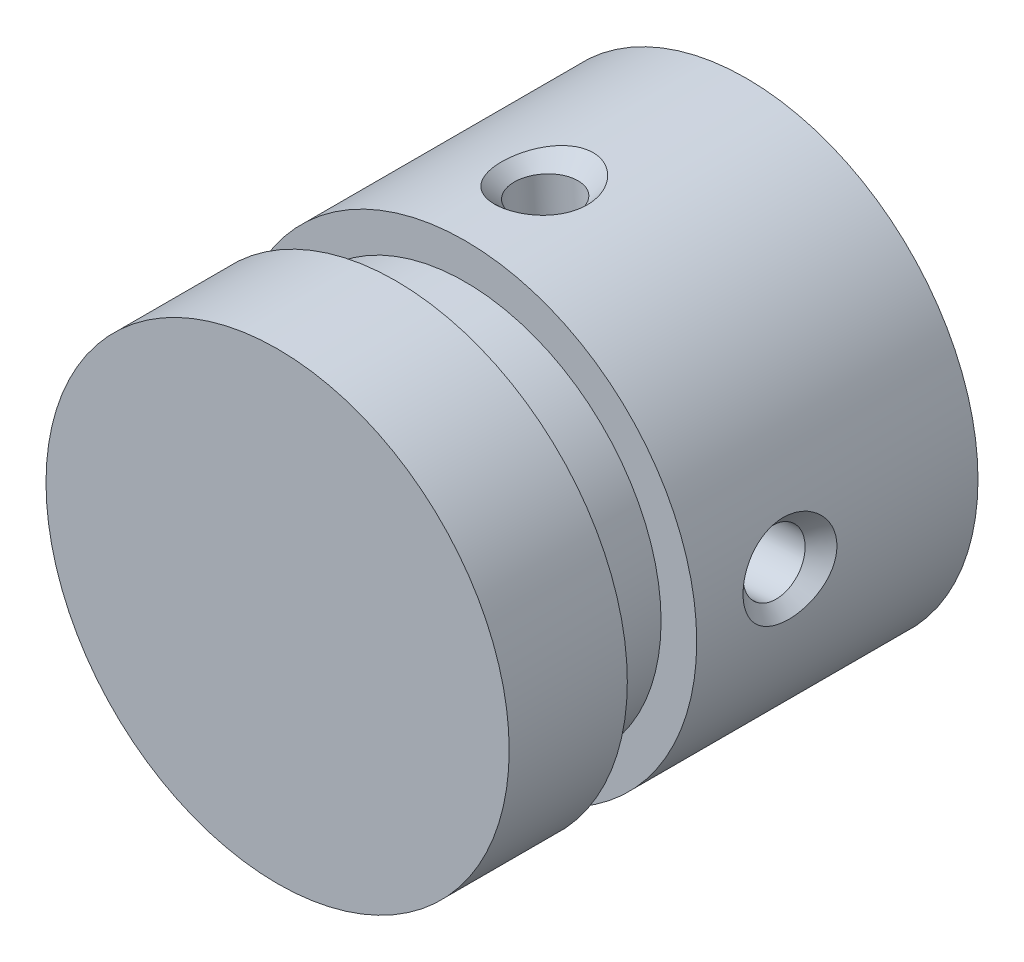
ISO-10303-21;
HEADER;
FILE_DESCRIPTION(('STEP AP214'),'2;1');
FILE_NAME('part.step','',(''),(''),'','','');
FILE_SCHEMA(('AUTOMOTIVE_DESIGN { 1 0 10303 214 1 1 1 1 }'));
ENDSEC;
DATA;
#1=APPLICATION_CONTEXT('core data for automotive mechanical design processes');
#2=APPLICATION_PROTOCOL_DEFINITION('international standard','automotive_design',2000,#1);
#3=PRODUCT_CONTEXT('',#1,'mechanical');
#4=PRODUCT('Part','Part','',(#3));
#5=PRODUCT_RELATED_PRODUCT_CATEGORY('part','',(#4));
#6=PRODUCT_DEFINITION_FORMATION('','',#4);
#7=PRODUCT_DEFINITION_CONTEXT('part definition',#1,'design');
#8=PRODUCT_DEFINITION('design','',#6,#7);
#9=PRODUCT_DEFINITION_SHAPE('','',#8);
#10=(LENGTH_UNIT() NAMED_UNIT(*) SI_UNIT(.MILLI.,.METRE.));
#11=(NAMED_UNIT(*) PLANE_ANGLE_UNIT() SI_UNIT($,.RADIAN.));
#12=(NAMED_UNIT(*) SI_UNIT($,.STERADIAN.) SOLID_ANGLE_UNIT());
#13=UNCERTAINTY_MEASURE_WITH_UNIT(LENGTH_MEASURE(1.E-05),#10,'distance_accuracy_value','');
#14=(GEOMETRIC_REPRESENTATION_CONTEXT(3) GLOBAL_UNCERTAINTY_ASSIGNED_CONTEXT((#13)) GLOBAL_UNIT_ASSIGNED_CONTEXT((#10,
#11,#12)) REPRESENTATION_CONTEXT('',''));
#15=CARTESIAN_POINT('',(0.,0.,0.));
#16=DIRECTION('',(0.,0.,1.));
#17=DIRECTION('',(1.,0.,0.));
#18=AXIS2_PLACEMENT_3D('',#15,#16,#17);
#19=CARTESIAN_POINT('',(0.,0.,25.));
#20=DIRECTION('',(0.,0.,-1.));
#21=DIRECTION('',(-1.,0.,0.));
#22=AXIS2_PLACEMENT_3D('',#19,#20,#21);
#23=CYLINDRICAL_SURFACE('',#22,12.35);
#24=CARTESIAN_POINT('',(0.,0.,0.));
#25=DIRECTION('',(0.,0.,1.));
#26=DIRECTION('',(1.,0.,0.));
#27=AXIS2_PLACEMENT_3D('',#24,#25,#26);
#28=CIRCLE('',#27,12.35);
#29=CARTESIAN_POINT('',(12.35,0.,0.));
#30=VERTEX_POINT('',#29);
#31=EDGE_CURVE('E128',#30,#30,#28,.T.);
#32=ORIENTED_EDGE('',*,*,#31,.T.);
#33=EDGE_LOOP('',(#32));
#34=FACE_BOUND('',#33,.T.);
#35=CARTESIAN_POINT('',(-2.14445012576023,12.1623944390861,7.99854520423865));
#36=CARTESIAN_POINT('',(-2.05248965444552,12.1786080947724,7.92261083689134));
#37=CARTESIAN_POINT('',(-1.95459043839527,12.1947909562161,7.85383672078203));
#38=CARTESIAN_POINT('',(-1.74876403507585,12.2260027582202,7.73295754496976));
#39=CARTESIAN_POINT('',(-1.64083616347095,12.2410316199058,7.68085362388761));
#40=CARTESIAN_POINT('',(-1.41212457402826,12.2695672463463,7.59340282051027));
#41=CARTESIAN_POINT('',(-1.29097326411596,12.2829672865543,7.55897325286086));
#42=CARTESIAN_POINT('',(-1.04413000846501,12.3064062867462,7.51253094688949));
#43=CARTESIAN_POINT('',(-0.918439319187852,12.3164461690125,7.50051205322989));
#44=CARTESIAN_POINT('',(-0.675698030104013,12.3320589155647,7.49955498806939));
#45=CARTESIAN_POINT('',(-0.558667982671112,12.3378984564503,7.50903776324741));
#46=CARTESIAN_POINT('',(-0.327738674063508,12.3461912217196,7.54742218348827));
#47=CARTESIAN_POINT('',(-0.213839111754561,12.3486447729407,7.57632195389715));
#48=CARTESIAN_POINT('',(0.00712151588528481,12.3504901915595,7.65203728876816));
#49=CARTESIAN_POINT('',(0.114216784791292,12.3498988442682,7.69875332035321));
#50=CARTESIAN_POINT('',(0.319764512159961,12.3462883158084,7.80828208782504));
#51=CARTESIAN_POINT('',(0.418214929060633,12.3432685628507,7.87109861233971));
#52=CARTESIAN_POINT('',(0.610594036534136,12.3352968399232,8.01527962322423));
#53=CARTESIAN_POINT('',(0.703811405001816,12.3302319048806,8.09758519969596));
#54=CARTESIAN_POINT('',(0.876514676151976,12.3191609779337,8.27545378345679));
#55=CARTESIAN_POINT('',(0.95599537166924,12.313154630806,8.37102179349911));
#56=CARTESIAN_POINT('',(1.10655578799026,12.3005799291626,8.58208826047784));
#57=CARTESIAN_POINT('',(1.17620182156481,12.2940104274476,8.69861018779477));
#58=CARTESIAN_POINT('',(1.29646041080678,12.2819115591784,8.94114049404131));
#59=CARTESIAN_POINT('',(1.34706663119011,12.2763825391382,9.06715201381749));
#60=CARTESIAN_POINT('',(1.43130478263113,12.2668581473865,9.33463620080081));
#61=CARTESIAN_POINT('',(1.46348579526123,12.2629986380813,9.47657230980064));
#62=CARTESIAN_POINT('',(1.50450180070155,12.2580341632864,9.7638299755613));
#63=CARTESIAN_POINT('',(1.51333243015598,12.2569297126212,9.9091521599417));
#64=CARTESIAN_POINT('',(1.50738869690031,12.2576627651379,10.2037779358134));
#65=CARTESIAN_POINT('',(1.49188333776727,12.2595913779993,10.3530672000059));
#66=CARTESIAN_POINT('',(1.43618352838113,12.2662404008367,10.6469266706734));
#67=CARTESIAN_POINT('',(1.39598632582569,12.2709611220359,10.7914963491826));
#68=CARTESIAN_POINT('',(1.29171367785535,12.2823740630543,11.071559873785));
#69=CARTESIAN_POINT('',(1.227658041762,12.2890646463618,11.2070611394563));
#70=CARTESIAN_POINT('',(1.07690064068408,12.3031904206987,11.4648376698635));
#71=CARTESIAN_POINT('',(0.990199918513972,12.3106255774304,11.5871135432669));
#72=CARTESIAN_POINT('',(0.799522048382524,12.3244491980962,11.8098969015238));
#73=CARTESIAN_POINT('',(0.696280858260916,12.3308657426719,11.9110304833458));
#74=CARTESIAN_POINT('',(0.472927965312659,12.3414456772621,12.0927332686475));
#75=CARTESIAN_POINT('',(0.352826745350583,12.3456104595815,12.1733151632792));
#76=CARTESIAN_POINT('',(0.109833128047279,12.3500583608054,12.3042503995803));
#77=CARTESIAN_POINT('',(-0.0119985029205748,12.3506352080917,12.3565588578163));
#78=CARTESIAN_POINT('',(-0.263148991651637,12.3478322333979,12.4378810569299));
#79=CARTESIAN_POINT('',(-0.392462123874528,12.3444554000436,12.4669123652983));
#80=CARTESIAN_POINT('',(-0.641926210465268,12.3338788645563,12.49853393942));
#81=CARTESIAN_POINT('',(-0.761818671692627,12.3270615379371,12.5033209729356));
#82=CARTESIAN_POINT('',(-1.00037269284963,12.3099975722815,12.4921673883021));
#83=CARTESIAN_POINT('',(-1.11903451655654,12.2997516844751,12.4762313085766));
#84=CARTESIAN_POINT('',(-1.34760879198563,12.2767754283947,12.4253100566974));
#85=CARTESIAN_POINT('',(-1.4576816348747,12.264141786243,12.3909935668253));
#86=CARTESIAN_POINT('',(-1.67065315736897,12.2369504635874,12.3052156407672));
#87=CARTESIAN_POINT('',(-1.77355079050204,12.2223925033231,12.2537517100021));
#88=CARTESIAN_POINT('',(-1.9743545199992,12.1916040239678,12.1329390978895));
#89=CARTESIAN_POINT('',(-2.0718348752524,12.1753279082824,12.0628965932412));
#90=CARTESIAN_POINT('',(-2.25474906200698,12.1427861519989,11.9085567998172));
#91=CARTESIAN_POINT('',(-2.34017869037082,12.1265205170156,11.8242545598652));
#92=CARTESIAN_POINT('',(-2.50462240898284,12.0936767304406,11.6358287537336));
#93=CARTESIAN_POINT('',(-2.58240396863084,12.0771977994234,11.5306122704853));
#94=CARTESIAN_POINT('',(-2.7209292039106,12.0467458514529,11.3091820539332));
#95=CARTESIAN_POINT('',(-2.78166653813951,12.032773767882,11.1929642489733));
#96=CARTESIAN_POINT('',(-2.88950418723412,12.0073561127302,10.9425988723248));
#97=CARTESIAN_POINT('',(-2.93507997488727,11.9962112334152,10.8077624083351));
#98=CARTESIAN_POINT('',(-3.00458621286631,11.9789919063315,10.5323124577699));
#99=CARTESIAN_POINT('',(-3.02851209015882,11.9729185298192,10.3916977572324));
#100=CARTESIAN_POINT('',(-3.05491639090524,11.9662105165435,10.1020601944791));
#101=CARTESIAN_POINT('',(-3.056402270712,11.9658275853263,9.95294003167506));
#102=CARTESIAN_POINT('',(-3.03533311199372,11.9711889378946,9.65648242390036));
#103=CARTESIAN_POINT('',(-3.01277170481189,11.976934844835,9.50914546164447));
#104=CARTESIAN_POINT('',(-2.94365967170237,11.994108629824,9.21909123323444));
#105=CARTESIAN_POINT('',(-2.89688872699484,12.0055886570037,9.07642941455098));
#106=CARTESIAN_POINT('',(-2.78002970220316,12.0331841319973,8.8015061574155));
#107=CARTESIAN_POINT('',(-2.70995527523693,12.0492968648403,8.66923868505763));
#108=CARTESIAN_POINT('',(-2.56228525508687,12.08146584993,8.44176506759159));
#109=CARTESIAN_POINT('',(-2.48825935692575,12.0970197695726,8.34415608161486));
#110=CARTESIAN_POINT('',(-2.32637216874608,12.1291917229829,8.16138674617226));
#111=CARTESIAN_POINT('',(-2.23851818595313,12.1458091919986,8.07621986745227));
#112=CARTESIAN_POINT('',(-2.14445012576023,12.1623944390861,7.99854520423865));
#113=B_SPLINE_CURVE_WITH_KNOTS('',3,(#35,#36,#37,#38,#39,#40,#41,#42,#43,#44,#45,#46,#47,#48,
#49,#50,#51,#52,#53,#54,#55,#56,#57,#58,#59,#60,#61,#62,#63,#64,#65,#66,#67,#68,#69,#70,#71,#72,
#73,#74,#75,#76,#77,#78,#79,#80,#81,#82,#83,#84,#85,#86,#87,#88,#89,#90,#91,#92,#93,#94,#95,#96,
#97,#98,#99,#100,#101,#102,#103,#104,#105,#106,#107,#108,#109,#110,#111,#112),.UNSPECIFIED.,.T.,
.F.,(4,2,2,2,2,2,2,2,2,2,2,2,2,2,2,2,2,2,2,2,2,2,2,2,2,2,2,2,2,2,2,2,2,2,2,2,2,2,4),(0.,
0.360697896573639,0.721420424562622,1.09934032479267,1.47715640987467,1.82813147954376,
2.1790726684672,2.52808133676852,2.87717220627063,3.24898333178193,3.620935092195,
4.02691339971556,4.43302667274306,4.8678164925526,5.30268755336961,5.75087314321686,
6.19910869961075,6.64697291895085,7.09481651761557,7.52650648086487,7.95792921636479,
8.35351120326701,8.7487943588466,9.10752563251587,9.46617835619893,9.81259073432849,
10.1590535299334,10.5209303615349,10.8829331006448,11.2768998931986,11.6710130696302,
12.0974083422696,12.5238936598521,12.9691902322248,13.4146047657571,13.8641459769678,
14.3134242722059,14.6825832204578,15.0515477435975),.UNSPECIFIED.);
#114=CARTESIAN_POINT('',(-2.14445012576023,12.1623944390861,7.99854520423865));
#115=VERTEX_POINT('',#114);
#116=EDGE_CURVE('E133',#115,#115,#113,.T.);
#117=ORIENTED_EDGE('',*,*,#116,.T.);
#118=EDGE_LOOP('',(#117));
#119=FACE_BOUND('',#118,.T.);
#120=CARTESIAN_POINT('',(12.3176835470682,-0.892845319650519,8.29913979836174));
#121=CARTESIAN_POINT('',(12.3121292183917,-0.969478473059959,8.38864786139083));
#122=CARTESIAN_POINT('',(12.3063245005544,-1.03966611151699,8.48368484648404));
#123=CARTESIAN_POINT('',(12.2949795787909,-1.16619825585901,8.68263671351298));
#124=CARTESIAN_POINT('',(12.2894396131235,-1.22253047504311,8.78655936582693));
#125=CARTESIAN_POINT('',(12.2782462170663,-1.3306881651279,9.02322402492665));
#126=CARTESIAN_POINT('',(12.2728034154738,-1.37920868214942,9.15749978300712));
#127=CARTESIAN_POINT('',(12.2641486408597,-1.45416100762553,9.4321646923341));
#128=CARTESIAN_POINT('',(12.2609376498835,-1.48058309332696,9.57255650594127));
#129=CARTESIAN_POINT('',(12.257166682612,-1.51150005327697,9.86178120865532));
#130=CARTESIAN_POINT('',(12.256724135461,-1.5150238844724,10.0107204842398));
#131=CARTESIAN_POINT('',(12.2588789748422,-1.49748406667553,10.3071261216986));
#132=CARTESIAN_POINT('',(12.261476576192,-1.47641868020297,10.4545923787464));
#133=CARTESIAN_POINT('',(12.2693204276994,-1.40975497496277,10.7454213127903));
#134=CARTESIAN_POINT('',(12.2745936848182,-1.36390618827934,10.8887260742042));
#135=CARTESIAN_POINT('',(12.286878786335,-1.24838591902901,11.1653586353478));
#136=CARTESIAN_POINT('',(12.2938907491253,-1.17871281408996,11.2986857548731));
#137=CARTESIAN_POINT('',(12.3081798754372,-1.01858654813389,11.5484162099865));
#138=CARTESIAN_POINT('',(12.3154487430354,-0.928584911868509,11.6651086321741));
#139=CARTESIAN_POINT('',(12.3288712901818,-0.728970556929112,11.8804425910017));
#140=CARTESIAN_POINT('',(12.3350253845401,-0.619365163161092,11.9790908420593));
#141=CARTESIAN_POINT('',(12.3442964972625,-0.391146788674996,12.1482248869322));
#142=CARTESIAN_POINT('',(12.3475866462029,-0.273600385778777,12.2201362226807));
#143=CARTESIAN_POINT('',(12.3505818462084,-0.0271873298599952,12.3409567432089));
#144=CARTESIAN_POINT('',(12.3502898614433,0.101669875955458,12.389884911456));
#145=CARTESIAN_POINT('',(12.3455200886183,0.353448573898841,12.458532296546));
#146=CARTESIAN_POINT('',(12.3414512499534,0.475732607420104,12.4806252492439));
#147=CARTESIAN_POINT('',(12.3294879726764,0.722081192778374,12.5027322072646));
#148=CARTESIAN_POINT('',(12.3215951856937,0.84614495349159,12.5027557362625));
#149=CARTESIAN_POINT('',(12.3028574975372,1.08424002631848,12.4814422820176));
#150=CARTESIAN_POINT('',(12.2922292919902,1.19841184211409,12.4614475936766));
#151=CARTESIAN_POINT('',(12.2684172753809,1.42163399633922,12.4030146361496));
#152=CARTESIAN_POINT('',(12.255233382958,1.53068417158306,12.3645757797328));
#153=CARTESIAN_POINT('',(12.226902848811,1.74269466061617,12.2700824592111));
#154=CARTESIAN_POINT('',(12.2117279963867,1.84552848694836,12.2137540511779));
#155=CARTESIAN_POINT('',(12.180582380558,2.0410116824354,12.0857700082767));
#156=CARTESIAN_POINT('',(12.1646113899258,2.13365811951203,12.0141099781361));
#157=CARTESIAN_POINT('',(12.131673555044,2.3138789574501,11.8516402975734));
#158=CARTESIAN_POINT('',(12.1147252140169,2.40050702397062,11.7597782895382));
#159=CARTESIAN_POINT('',(12.0823105853896,2.55867219590661,11.5636512343017));
#160=CARTESIAN_POINT('',(12.0668448707618,2.63020347978164,11.4593814266206));
#161=CARTESIAN_POINT('',(12.0371946424578,2.76287692028569,11.2313330199826));
#162=CARTESIAN_POINT('',(12.0232499484304,2.82250900640123,11.1066433575339));
#163=CARTESIAN_POINT('',(11.999519600097,2.92175275872793,10.8491650036232));
#164=CARTESIAN_POINT('',(11.9897351724523,2.96135852079587,10.7163739366279));
#165=CARTESIAN_POINT('',(11.9746694723885,3.02172726528047,10.4379152353954));
#166=CARTESIAN_POINT('',(11.9696939894766,3.04121553642296,10.2919532582132));
#167=CARTESIAN_POINT('',(11.9657464209688,3.05670971543623,9.99870024200674));
#168=CARTESIAN_POINT('',(11.9667752780144,3.05271193615231,9.8514089979206));
#169=CARTESIAN_POINT('',(11.974830736105,3.02096089535952,9.55641805532063));
#170=CARTESIAN_POINT('',(11.981983076352,2.99270957983336,9.40877496811463));
#171=CARTESIAN_POINT('',(12.0017911000232,2.9122524240593,9.12051998857677));
#172=CARTESIAN_POINT('',(12.0144473086826,2.8600442975829,8.9799087687254));
#173=CARTESIAN_POINT('',(12.0439494345884,2.73312535318501,8.71120522120576));
#174=CARTESIAN_POINT('',(12.0607575806563,2.65861618603528,8.58301379463014));
#175=CARTESIAN_POINT('',(12.0970496613495,2.48826143723264,8.34205513949917));
#176=CARTESIAN_POINT('',(12.116533154003,2.3924193781905,8.22928536938797));
#177=CARTESIAN_POINT('',(12.1553187284696,2.18658005340009,8.0286454288102));
#178=CARTESIAN_POINT('',(12.1745833386899,2.07750078772069,7.93982931313887));
#179=CARTESIAN_POINT('',(12.2120491036225,1.84450867581871,7.78411221367805));
#180=CARTESIAN_POINT('',(12.2302510486054,1.720607067101,7.71719476948392));
#181=CARTESIAN_POINT('',(12.2623325291403,1.47368370860541,7.61378377795244));
#182=CARTESIAN_POINT('',(12.2764556108814,1.35162849570006,7.57505862941315));
#183=CARTESIAN_POINT('',(12.3013556543306,1.10218353454897,7.5205774036054));
#184=CARTESIAN_POINT('',(12.3121347749104,0.974797288583527,7.50480648263291));
#185=CARTESIAN_POINT('',(12.3289892101541,0.729642636717153,7.4973973130804));
#186=CARTESIAN_POINT('',(12.3353794874842,0.611948812207324,7.50387351574701));
#187=CARTESIAN_POINT('',(12.3447265761464,0.379194310102931,7.53653588266576));
#188=CARTESIAN_POINT('',(12.3476833768167,0.264133640685969,7.56272210812136));
#189=CARTESIAN_POINT('',(12.3504293665494,0.0411991506576675,7.63318438060323));
#190=CARTESIAN_POINT('',(12.3502555646871,-0.0667435157138878,7.67724306210133));
#191=CARTESIAN_POINT('',(12.347389466449,-0.274328205776085,7.7816741921792));
#192=CARTESIAN_POINT('',(12.3446977648233,-0.373972183637021,7.84204278581944));
#193=CARTESIAN_POINT('',(12.3381376396965,-0.5468364859839,7.96548865527669));
#194=CARTESIAN_POINT('',(12.3345477747642,-0.62166652353937,8.02635273930887));
#195=CARTESIAN_POINT('',(12.326588685518,-0.763378056578602,8.15662976348948));
#196=CARTESIAN_POINT('',(12.3222196153449,-0.830261119764232,8.22604101201639));
#197=CARTESIAN_POINT('',(12.3176835470682,-0.892845319650519,8.29913979836174));
#198=B_SPLINE_CURVE_WITH_KNOTS('',3,(#120,#121,#122,#123,#124,#125,#126,#127,#128,#129,#130,
#131,#132,#133,#134,#135,#136,#137,#138,#139,#140,#141,#142,#143,#144,#145,#146,#147,#148,#149,
#150,#151,#152,#153,#154,#155,#156,#157,#158,#159,#160,#161,#162,#163,#164,#165,#166,#167,#168,
#169,#170,#171,#172,#173,#174,#175,#176,#177,#178,#179,#180,#181,#182,#183,#184,#185,#186,#187,
#188,#189,#190,#191,#192,#193,#194,#195,#196,#197),.UNSPECIFIED.,.T.,.F.,(4,2,2,2,2,2,2,2,2,2,2,
2,2,2,2,2,2,2,2,2,2,2,2,2,2,2,2,2,2,2,2,2,2,2,2,2,2,2,4),(0.,0.353634988566852,
0.707582451794932,1.13426475467683,1.56113468841534,2.00599487508765,2.45088649759462,
2.90036075377522,3.34986562404396,3.79022692642016,4.23042403108544,4.64166881680031,
5.05257332568744,5.42360274165367,5.79447204626962,6.14203430494519,6.48960763014571,
6.84278317597803,7.19606010624712,7.57665766545361,7.95740172157586,8.37234143990308,
8.78740341916985,9.22739662169402,9.66745890208888,10.1167802498528,10.5661444858367,
11.011562296484,11.4569066116522,11.880537376467,12.3038489786932,12.6882394701508,
13.07238127898,13.4247966998798,13.7772132151024,14.1254663277833,14.473637200781,
14.7624982999726,15.0513023205119),.UNSPECIFIED.);
#199=CARTESIAN_POINT('',(12.3176835470682,-0.892845319650519,8.29913979836174));
#200=VERTEX_POINT('',#199);
#201=EDGE_CURVE('E144',#200,#200,#198,.T.);
#202=ORIENTED_EDGE('',*,*,#201,.T.);
#203=EDGE_LOOP('',(#202));
#204=FACE_BOUND('',#203,.T.);
#205=CARTESIAN_POINT('',(-0.892845319650476,-12.3176835470682,8.29913979836174));
#206=CARTESIAN_POINT('',(-0.969478473059915,-12.3121292183917,8.38864786139083));
#207=CARTESIAN_POINT('',(-1.03966611151695,-12.3063245005544,8.48368484648404));
#208=CARTESIAN_POINT('',(-1.16619825585896,-12.2949795787909,8.68263671351298));
#209=CARTESIAN_POINT('',(-1.22253047504307,-12.2894396131235,8.78655936582692));
#210=CARTESIAN_POINT('',(-1.33068816512786,-12.2782462170663,9.02322402492665));
#211=CARTESIAN_POINT('',(-1.37920868214938,-12.2728034154738,9.15749978300711));
#212=CARTESIAN_POINT('',(-1.45416100762549,-12.2641486408597,9.4321646923341));
#213=CARTESIAN_POINT('',(-1.48058309332692,-12.2609376498835,9.57255650594127));
#214=CARTESIAN_POINT('',(-1.51150005327693,-12.257166682612,9.86178120865531));
#215=CARTESIAN_POINT('',(-1.51502388447236,-12.256724135461,10.0107204842398));
#216=CARTESIAN_POINT('',(-1.49748406667549,-12.2588789748422,10.3071261216986));
#217=CARTESIAN_POINT('',(-1.47641868020293,-12.261476576192,10.4545923787464));
#218=CARTESIAN_POINT('',(-1.40975497496273,-12.2693204276994,10.7454213127903));
#219=CARTESIAN_POINT('',(-1.3639061882793,-12.2745936848182,10.8887260742042));
#220=CARTESIAN_POINT('',(-1.24838591902897,-12.286878786335,11.1653586353478));
#221=CARTESIAN_POINT('',(-1.17871281408992,-12.2938907491253,11.2986857548731));
#222=CARTESIAN_POINT('',(-1.01858654813385,-12.3081798754372,11.5484162099865));
#223=CARTESIAN_POINT('',(-0.928584911868466,-12.3154487430354,11.6651086321741));
#224=CARTESIAN_POINT('',(-0.728970556929069,-12.3288712901818,11.8804425910017));
#225=CARTESIAN_POINT('',(-0.619365163161049,-12.3350253845401,11.9790908420593));
#226=CARTESIAN_POINT('',(-0.391146788674953,-12.3442964972625,12.1482248869322));
#227=CARTESIAN_POINT('',(-0.273600385778735,-12.3475866462029,12.2201362226807));
#228=CARTESIAN_POINT('',(-0.027187329859953,-12.3505818462084,12.3409567432089));
#229=CARTESIAN_POINT('',(0.1016698759555,-12.3502898614433,12.389884911456));
#230=CARTESIAN_POINT('',(0.353448573898884,-12.3455200886183,12.458532296546));
#231=CARTESIAN_POINT('',(0.475732607420147,-12.3414512499534,12.4806252492439));
#232=CARTESIAN_POINT('',(0.722081192778417,-12.3294879726764,12.5027322072646));
#233=CARTESIAN_POINT('',(0.846144953491632,-12.3215951856937,12.5027557362625));
#234=CARTESIAN_POINT('',(1.08424002631852,-12.3028574975372,12.4814422820176));
#235=CARTESIAN_POINT('',(1.19841184211413,-12.2922292919901,12.4614475936766));
#236=CARTESIAN_POINT('',(1.42163399633926,-12.2684172753809,12.4030146361496));
#237=CARTESIAN_POINT('',(1.5306841715831,-12.255233382958,12.3645757797328));
#238=CARTESIAN_POINT('',(1.74269466061621,-12.226902848811,12.2700824592111));
#239=CARTESIAN_POINT('',(1.84552848694841,-12.2117279963867,12.2137540511779));
#240=CARTESIAN_POINT('',(2.04101168243545,-12.180582380558,12.0857700082767));
#241=CARTESIAN_POINT('',(2.13365811951207,-12.1646113899257,12.0141099781361));
#242=CARTESIAN_POINT('',(2.31387895745014,-12.131673555044,11.8516402975734));
#243=CARTESIAN_POINT('',(2.40050702397066,-12.1147252140169,11.7597782895382));
#244=CARTESIAN_POINT('',(2.55867219590666,-12.0823105853896,11.5636512343017));
#245=CARTESIAN_POINT('',(2.63020347978168,-12.0668448707618,11.4593814266205));
#246=CARTESIAN_POINT('',(2.76287692028573,-12.0371946424578,11.2313330199826));
#247=CARTESIAN_POINT('',(2.82250900640127,-12.0232499484303,11.1066433575339));
#248=CARTESIAN_POINT('',(2.92175275872797,-11.999519600097,10.8491650036232));
#249=CARTESIAN_POINT('',(2.96135852079591,-11.9897351724523,10.716373936628));
#250=CARTESIAN_POINT('',(3.02172726528051,-11.9746694723885,10.4379152353954));
#251=CARTESIAN_POINT('',(3.041215536423,-11.9696939894766,10.2919532582132));
#252=CARTESIAN_POINT('',(3.05670971543627,-11.9657464209688,9.99870024200674));
#253=CARTESIAN_POINT('',(3.05271193615236,-11.9667752780144,9.8514089979206));
#254=CARTESIAN_POINT('',(3.02096089535957,-11.974830736105,9.55641805532063));
#255=CARTESIAN_POINT('',(2.9927095798334,-11.981983076352,9.40877496811463));
#256=CARTESIAN_POINT('',(2.91225242405935,-12.0017911000232,9.12051998857677));
#257=CARTESIAN_POINT('',(2.86004429758295,-12.0144473086826,8.9799087687254));
#258=CARTESIAN_POINT('',(2.73312535318505,-12.0439494345884,8.71120522120576));
#259=CARTESIAN_POINT('',(2.65861618603532,-12.0607575806562,8.58301379463013));
#260=CARTESIAN_POINT('',(2.48826143723268,-12.0970496613495,8.34205513949917));
#261=CARTESIAN_POINT('',(2.39241937819054,-12.116533154003,8.22928536938798));
#262=CARTESIAN_POINT('',(2.18658005340013,-12.1553187284696,8.0286454288102));
#263=CARTESIAN_POINT('',(2.07750078772073,-12.1745833386899,7.93982931313887));
#264=CARTESIAN_POINT('',(1.84450867581876,-12.2120491036225,7.78411221367805));
#265=CARTESIAN_POINT('',(1.72060706710104,-12.2302510486054,7.71719476948392));
#266=CARTESIAN_POINT('',(1.47368370860545,-12.2623325291403,7.61378377795244));
#267=CARTESIAN_POINT('',(1.35162849570011,-12.2764556108814,7.57505862941315));
#268=CARTESIAN_POINT('',(1.10218353454902,-12.3013556543306,7.5205774036054));
#269=CARTESIAN_POINT('',(0.97479728858357,-12.3121347749104,7.50480648263291));
#270=CARTESIAN_POINT('',(0.729642636717196,-12.3289892101541,7.4973973130804));
#271=CARTESIAN_POINT('',(0.611948812207367,-12.3353794874842,7.50387351574701));
#272=CARTESIAN_POINT('',(0.379194310102973,-12.3447265761464,7.53653588266576));
#273=CARTESIAN_POINT('',(0.264133640686011,-12.3476833768167,7.56272210812135));
#274=CARTESIAN_POINT('',(0.0411991506577104,-12.3504293665494,7.63318438060323));
#275=CARTESIAN_POINT('',(-0.0667435157138447,-12.3502555646871,7.67724306210133));
#276=CARTESIAN_POINT('',(-0.274328205776042,-12.347389466449,7.7816741921792));
#277=CARTESIAN_POINT('',(-0.373972183636977,-12.3446977648233,7.84204278581944));
#278=CARTESIAN_POINT('',(-0.546836485983856,-12.3381376396965,7.96548865527669));
#279=CARTESIAN_POINT('',(-0.621666523539328,-12.3345477747642,8.02635273930887));
#280=CARTESIAN_POINT('',(-0.76337805657856,-12.326588685518,8.15662976348948));
#281=CARTESIAN_POINT('',(-0.830261119764189,-12.3222196153449,8.22604101201639));
#282=CARTESIAN_POINT('',(-0.892845319650476,-12.3176835470682,8.29913979836174));
#283=B_SPLINE_CURVE_WITH_KNOTS('',3,(#205,#206,#207,#208,#209,#210,#211,#212,#213,#214,#215,
#216,#217,#218,#219,#220,#221,#222,#223,#224,#225,#226,#227,#228,#229,#230,#231,#232,#233,#234,
#235,#236,#237,#238,#239,#240,#241,#242,#243,#244,#245,#246,#247,#248,#249,#250,#251,#252,#253,
#254,#255,#256,#257,#258,#259,#260,#261,#262,#263,#264,#265,#266,#267,#268,#269,#270,#271,#272,
#273,#274,#275,#276,#277,#278,#279,#280,#281,#282),.UNSPECIFIED.,.T.,.F.,(4,2,2,2,2,2,2,2,2,2,2,
2,2,2,2,2,2,2,2,2,2,2,2,2,2,2,2,2,2,2,2,2,2,2,2,2,2,2,4),(0.,0.353634988566851,
0.707582451794931,1.13426475467683,1.56113468841534,2.00599487508765,2.45088649759462,
2.90036075377522,3.34986562404396,3.79022692642016,4.23042403108544,4.64166881680031,
5.05257332568745,5.42360274165367,5.79447204626962,6.14203430494519,6.48960763014571,
6.84278317597804,7.19606010624712,7.57665766545362,7.95740172157587,8.37234143990308,
8.78740341916985,9.22739662169403,9.66745890208889,10.1167802498528,10.5661444858367,
11.011562296484,11.4569066116522,11.880537376467,12.3038489786932,12.6882394701508,
13.07238127898,13.4247966998798,13.7772132151024,14.1254663277833,14.473637200781,
14.7624982999726,15.0513023205119),.UNSPECIFIED.);
#284=CARTESIAN_POINT('',(-0.892845319650476,-12.3176835470682,8.29913979836174));
#285=VERTEX_POINT('',#284);
#286=EDGE_CURVE('E62',#285,#285,#283,.T.);
#287=ORIENTED_EDGE('',*,*,#286,.T.);
#288=EDGE_LOOP('',(#287));
#289=FACE_BOUND('',#288,.T.);
#290=CARTESIAN_POINT('',(-12.1623944390861,-2.1444501257601,7.99854520423865));
#291=CARTESIAN_POINT('',(-12.1786080947724,-2.05248965444539,7.92261083689134));
#292=CARTESIAN_POINT('',(-12.1947909562161,-1.95459043839514,7.85383672078203));
#293=CARTESIAN_POINT('',(-12.2260027582202,-1.74876403507572,7.73295754496976));
#294=CARTESIAN_POINT('',(-12.2410316199058,-1.64083616347083,7.68085362388762));
#295=CARTESIAN_POINT('',(-12.2695672463463,-1.41212457402813,7.59340282051027));
#296=CARTESIAN_POINT('',(-12.2829672865543,-1.29097326411583,7.55897325286086));
#297=CARTESIAN_POINT('',(-12.3064062867462,-1.04413000846489,7.51253094688949));
#298=CARTESIAN_POINT('',(-12.3164461690125,-0.918439319187723,7.50051205322989));
#299=CARTESIAN_POINT('',(-12.3320589155647,-0.675698030103885,7.49955498806939));
#300=CARTESIAN_POINT('',(-12.3378984564503,-0.558667982670983,7.50903776324741));
#301=CARTESIAN_POINT('',(-12.3461912217196,-0.327738674063379,7.54742218348827));
#302=CARTESIAN_POINT('',(-12.3486447729407,-0.213839111754432,7.57632195389715));
#303=CARTESIAN_POINT('',(-12.3504901915595,0.00712151588541355,7.65203728876816));
#304=CARTESIAN_POINT('',(-12.3498988442682,0.114216784791421,7.69875332035321));
#305=CARTESIAN_POINT('',(-12.3462883158084,0.31976451216009,7.80828208782504));
#306=CARTESIAN_POINT('',(-12.3432685628507,0.418214929060761,7.87109861233971));
#307=CARTESIAN_POINT('',(-12.3352968399232,0.610594036534265,8.01527962322423));
#308=CARTESIAN_POINT('',(-12.3302319048806,0.703811405001945,8.09758519969596));
#309=CARTESIAN_POINT('',(-12.3191609779337,0.876514676152105,8.27545378345679));
#310=CARTESIAN_POINT('',(-12.313154630806,0.955995371669368,8.37102179349911));
#311=CARTESIAN_POINT('',(-12.3005799291626,1.10655578799039,8.58208826047784));
#312=CARTESIAN_POINT('',(-12.2940104274476,1.17620182156494,8.69861018779477));
#313=CARTESIAN_POINT('',(-12.2819115591784,1.29646041080691,8.94114049404131));
#314=CARTESIAN_POINT('',(-12.2763825391382,1.34706663119024,9.06715201381749));
#315=CARTESIAN_POINT('',(-12.2668581473865,1.43130478263126,9.33463620080081));
#316=CARTESIAN_POINT('',(-12.2629986380813,1.46348579526136,9.47657230980064));
#317=CARTESIAN_POINT('',(-12.2580341632863,1.50450180070168,9.7638299755613));
#318=CARTESIAN_POINT('',(-12.2569297126212,1.51333243015611,9.9091521599417));
#319=CARTESIAN_POINT('',(-12.2576627651379,1.50738869690044,10.2037779358134));
#320=CARTESIAN_POINT('',(-12.2595913779993,1.4918833377674,10.3530672000059));
#321=CARTESIAN_POINT('',(-12.2662404008367,1.43618352838126,10.6469266706734));
#322=CARTESIAN_POINT('',(-12.2709611220359,1.39598632582582,10.7914963491826));
#323=CARTESIAN_POINT('',(-12.2823740630543,1.29171367785548,11.071559873785));
#324=CARTESIAN_POINT('',(-12.2890646463618,1.22765804176213,11.2070611394563));
#325=CARTESIAN_POINT('',(-12.3031904206987,1.0769006406842,11.4648376698635));
#326=CARTESIAN_POINT('',(-12.3106255774304,0.990199918514098,11.5871135432669));
#327=CARTESIAN_POINT('',(-12.3244491980962,0.799522048382652,11.8098969015238));
#328=CARTESIAN_POINT('',(-12.3308657426719,0.696280858261045,11.9110304833458));
#329=CARTESIAN_POINT('',(-12.3414456772621,0.472927965312788,12.0927332686475));
#330=CARTESIAN_POINT('',(-12.3456104595815,0.352826745350712,12.1733151632792));
#331=CARTESIAN_POINT('',(-12.3500583608054,0.109833128047408,12.3042503995803));
#332=CARTESIAN_POINT('',(-12.3506352080917,-0.0119985029204456,12.3565588578163));
#333=CARTESIAN_POINT('',(-12.3478322333979,-0.263148991651507,12.4378810569299));
#334=CARTESIAN_POINT('',(-12.3444554000436,-0.392462123874398,12.4669123652983));
#335=CARTESIAN_POINT('',(-12.3338788645563,-0.641926210465137,12.49853393942));
#336=CARTESIAN_POINT('',(-12.3270615379372,-0.761818671692496,12.5033209729356));
#337=CARTESIAN_POINT('',(-12.3099975722815,-1.0003726928495,12.4921673883021));
#338=CARTESIAN_POINT('',(-12.2997516844751,-1.11903451655641,12.4762313085766));
#339=CARTESIAN_POINT('',(-12.2767754283947,-1.3476087919855,12.4253100566974));
#340=CARTESIAN_POINT('',(-12.264141786243,-1.45768163487457,12.3909935668253));
#341=CARTESIAN_POINT('',(-12.2369504635874,-1.67065315736884,12.3052156407672));
#342=CARTESIAN_POINT('',(-12.2223925033231,-1.77355079050191,12.2537517100021));
#343=CARTESIAN_POINT('',(-12.1916040239678,-1.97435451999907,12.1329390978895));
#344=CARTESIAN_POINT('',(-12.1753279082824,-2.07183487525227,12.0628965932412));
#345=CARTESIAN_POINT('',(-12.1427861519989,-2.25474906200686,11.9085567998172));
#346=CARTESIAN_POINT('',(-12.1265205170157,-2.34017869037069,11.8242545598652));
#347=CARTESIAN_POINT('',(-12.0936767304406,-2.50462240898272,11.6358287537336));
#348=CARTESIAN_POINT('',(-12.0771977994235,-2.58240396863071,11.5306122704853));
#349=CARTESIAN_POINT('',(-12.0467458514529,-2.72092920391047,11.3091820539332));
#350=CARTESIAN_POINT('',(-12.032773767882,-2.78166653813938,11.1929642489733));
#351=CARTESIAN_POINT('',(-12.0073561127303,-2.889504187234,10.9425988723248));
#352=CARTESIAN_POINT('',(-11.9962112334152,-2.93507997488715,10.8077624083351));
#353=CARTESIAN_POINT('',(-11.9789919063315,-3.00458621286618,10.5323124577699));
#354=CARTESIAN_POINT('',(-11.9729185298192,-3.0285120901587,10.3916977572324));
#355=CARTESIAN_POINT('',(-11.9662105165435,-3.05491639090512,10.1020601944791));
#356=CARTESIAN_POINT('',(-11.9658275853263,-3.05640227071188,9.95294003167506));
#357=CARTESIAN_POINT('',(-11.9711889378946,-3.03533311199359,9.65648242390037));
#358=CARTESIAN_POINT('',(-11.9769348448351,-3.01277170481176,9.50914546164448));
#359=CARTESIAN_POINT('',(-11.994108629824,-2.94365967170224,9.21909123323444));
#360=CARTESIAN_POINT('',(-12.0055886570037,-2.89688872699472,9.07642941455099));
#361=CARTESIAN_POINT('',(-12.0331841319974,-2.78002970220303,8.80150615741551));
#362=CARTESIAN_POINT('',(-12.0492968648403,-2.70995527523681,8.66923868505764));
#363=CARTESIAN_POINT('',(-12.08146584993,-2.56228525508675,8.4417650675916));
#364=CARTESIAN_POINT('',(-12.0970197695727,-2.48825935692563,8.34415608161486));
#365=CARTESIAN_POINT('',(-12.1291917229829,-2.32637216874596,8.16138674617226));
#366=CARTESIAN_POINT('',(-12.1458091919986,-2.238518185953,8.07621986745227));
#367=CARTESIAN_POINT('',(-12.1623944390861,-2.1444501257601,7.99854520423865));
#368=B_SPLINE_CURVE_WITH_KNOTS('',3,(#290,#291,#292,#293,#294,#295,#296,#297,#298,#299,#300,
#301,#302,#303,#304,#305,#306,#307,#308,#309,#310,#311,#312,#313,#314,#315,#316,#317,#318,#319,
#320,#321,#322,#323,#324,#325,#326,#327,#328,#329,#330,#331,#332,#333,#334,#335,#336,#337,#338,
#339,#340,#341,#342,#343,#344,#345,#346,#347,#348,#349,#350,#351,#352,#353,#354,#355,#356,#357,
#358,#359,#360,#361,#362,#363,#364,#365,#366,#367),.UNSPECIFIED.,.T.,.F.,(4,2,2,2,2,2,2,2,2,2,2,
2,2,2,2,2,2,2,2,2,2,2,2,2,2,2,2,2,2,2,2,2,2,2,2,2,2,2,4),(0.,0.360697896573639,
0.721420424562621,1.09934032479267,1.47715640987467,1.82813147954376,2.17907266846719,
2.52808133676852,2.87717220627063,3.24898333178193,3.620935092195,4.02691339971556,
4.43302667274306,4.8678164925526,5.3026875533696,5.75087314321686,6.19910869961075,
6.64697291895085,7.09481651761557,7.52650648086487,7.95792921636479,8.353511203267,
8.7487943588466,9.10752563251586,9.46617835619893,9.81259073432848,10.1590535299334,
10.5209303615349,10.8829331006448,11.2768998931986,11.6710130696302,12.0974083422696,
12.5238936598521,12.9691902322248,13.4146047657571,13.8641459769678,14.3134242722059,
14.6825832204578,15.0515477435975),.UNSPECIFIED.);
#369=CARTESIAN_POINT('',(-12.1623944390861,-2.1444501257601,7.99854520423865));
#370=VERTEX_POINT('',#369);
#371=EDGE_CURVE('E11',#370,#370,#368,.T.);
#372=ORIENTED_EDGE('',*,*,#371,.T.);
#373=EDGE_LOOP('',(#372));
#374=FACE_BOUND('',#373,.T.);
#375=CARTESIAN_POINT('',(-0.838502695540546,13.1737329370026,14.0009203309185));
#376=VERTEX_POINT('',#375);
#377=VERTEX_LOOP('',#376);
#378=FACE_BOUND('',#377,.T.);
#379=CARTESIAN_POINT('',(-0.838502695540546,13.1737329370026,14.0009203309185));
#380=VERTEX_POINT('',#379);
#381=VERTEX_LOOP('',#380);
#382=FACE_BOUND('',#381,.T.);
#383=CARTESIAN_POINT('',(-0.838502695540546,13.1737329370026,14.0009203309185));
#384=VERTEX_POINT('',#383);
#385=VERTEX_LOOP('',#384);
#386=FACE_BOUND('',#385,.T.);
#387=CARTESIAN_POINT('',(0.,0.,15.));
#388=DIRECTION('',(0.,0.,1.));
#389=DIRECTION('',(1.,0.,0.));
#390=AXIS2_PLACEMENT_3D('',#387,#388,#389);
#391=CIRCLE('',#390,12.35);
#392=CARTESIAN_POINT('',(12.35,0.,15.));
#393=VERTEX_POINT('',#392);
#394=EDGE_CURVE('E105',#393,#393,#391,.T.);
#395=ORIENTED_EDGE('',*,*,#394,.F.);
#396=EDGE_LOOP('',(#395));
#397=FACE_BOUND('',#396,.T.);
#398=ADVANCED_FACE('F49',(#34,#119,#204,#289,#374,#378,#382,#386,#397),#23,.T.);
#399=CARTESIAN_POINT('',(0.,0.,0.));
#400=DIRECTION('',(0.,0.,1.));
#401=DIRECTION('',(1.,0.,0.));
#402=AXIS2_PLACEMENT_3D('',#399,#400,#401);
#403=PLANE('',#402);
#404=ORIENTED_EDGE('',*,*,#31,.F.);
#405=EDGE_LOOP('',(#404));
#406=FACE_BOUND('',#405,.T.);
#407=ADVANCED_FACE('F155',(#406),#403,.F.);
#408=CARTESIAN_POINT('',(-0.784484958028555,12.3250591621552,10.));
#409=DIRECTION('',(-0.0635210492330813,0.997980498959939,0.));
#410=DIRECTION('',(-0.997980498959939,-0.0635210492330813,0.));
#411=AXIS2_PLACEMENT_3D('',#408,#409,#410);
#412=CONICAL_SURFACE('',#411,2.5,0.785398163397447);
#413=CARTESIAN_POINT('',(-0.730492066180436,11.4767757380393,10.));
#414=DIRECTION('',(-0.0635210492330813,0.997980498959939,0.));
#415=DIRECTION('',(-0.997980498959939,-0.0635210492330813,0.));
#416=AXIS2_PLACEMENT_3D('',#413,#414,#415);
#417=CIRCLE('',#416,1.65);
#418=CARTESIAN_POINT('',(-2.37715988946433,11.3719660068047,10.));
#419=VERTEX_POINT('',#418);
#420=EDGE_CURVE('E120',#419,#419,#417,.T.);
#421=ORIENTED_EDGE('',*,*,#420,.F.);
#422=EDGE_LOOP('',(#421));
#423=FACE_BOUND('',#422,.T.);
#424=ORIENTED_EDGE('',*,*,#116,.F.);
#425=EDGE_LOOP('',(#424));
#426=FACE_BOUND('',#425,.T.);
#427=ADVANCED_FACE('F149',(#423,#426),#412,.F.);
#428=CARTESIAN_POINT('',(-0.212795514930823,3.34323467151579,10.));
#429=DIRECTION('',(-0.0635210492330813,0.997980498959939,0.));
#430=DIRECTION('',(-0.997980498959939,-0.0635210492330813,0.));
#431=AXIS2_PLACEMENT_3D('',#428,#429,#430);
#432=CONICAL_SURFACE('',#431,1.65,1.02974425867665);
#433=CARTESIAN_POINT('',(-0.149819474941099,2.35381682388466,10.));
#434=VERTEX_POINT('',#433);
#435=VERTEX_LOOP('',#434);
#436=FACE_BOUND('',#435,.T.);
#437=CARTESIAN_POINT('',(-0.212795514930823,3.34323467151579,10.));
#438=DIRECTION('',(-0.0635210492330813,0.997980498959939,0.));
#439=DIRECTION('',(-0.997980498959939,-0.0635210492330813,0.));
#440=AXIS2_PLACEMENT_3D('',#437,#438,#439);
#441=CIRCLE('',#440,1.65);
#442=CARTESIAN_POINT('',(-1.85946333821472,3.23842494028121,10.));
#443=VERTEX_POINT('',#442);
#444=EDGE_CURVE('E124',#443,#443,#441,.T.);
#445=ORIENTED_EDGE('',*,*,#444,.T.);
#446=EDGE_LOOP('',(#445));
#447=FACE_BOUND('',#446,.T.);
#448=ADVANCED_FACE('F154',(#436,#447),#432,.F.);
#449=CARTESIAN_POINT('',(-0.784484958028555,12.3250591621552,10.));
#450=DIRECTION('',(-0.0635210492330813,0.997980498959939,0.));
#451=DIRECTION('',(-0.997980498959939,-0.0635210492330813,0.));
#452=AXIS2_PLACEMENT_3D('',#449,#450,#451);
#453=CYLINDRICAL_SURFACE('',#452,1.65);
#454=ORIENTED_EDGE('',*,*,#444,.F.);
#455=EDGE_LOOP('',(#454));
#456=FACE_BOUND('',#455,.T.);
#457=ORIENTED_EDGE('',*,*,#420,.T.);
#458=EDGE_LOOP('',(#457));
#459=FACE_BOUND('',#458,.T.);
#460=ADVANCED_FACE('F159',(#456,#459),#453,.F.);
#461=CARTESIAN_POINT('',(12.3250591621553,0.784484958028512,10.));
#462=DIRECTION('',(0.997980498959939,0.0635210492330778,0.));
#463=DIRECTION('',(-0.0635210492330778,0.997980498959939,0.));
#464=AXIS2_PLACEMENT_3D('',#461,#462,#463);
#465=CONICAL_SURFACE('',#464,2.5,0.785398163397447);
#466=CARTESIAN_POINT('',(11.4767757380393,0.730492066180396,10.));
#467=DIRECTION('',(0.997980498959939,0.0635210492330778,0.));
#468=DIRECTION('',(-0.0635210492330778,0.997980498959939,0.));
#469=AXIS2_PLACEMENT_3D('',#466,#467,#468);
#470=CIRCLE('',#469,1.65);
#471=CARTESIAN_POINT('',(11.3719660068047,2.37715988946429,10.));
#472=VERTEX_POINT('',#471);
#473=EDGE_CURVE('E112',#472,#472,#470,.T.);
#474=ORIENTED_EDGE('',*,*,#473,.F.);
#475=EDGE_LOOP('',(#474));
#476=FACE_BOUND('',#475,.T.);
#477=ORIENTED_EDGE('',*,*,#201,.F.);
#478=EDGE_LOOP('',(#477));
#479=FACE_BOUND('',#478,.T.);
#480=ADVANCED_FACE('F162',(#476,#479),#465,.F.);
#481=CARTESIAN_POINT('',(3.34323467151579,0.212795514930812,10.));
#482=DIRECTION('',(0.997980498959939,0.0635210492330778,0.));
#483=DIRECTION('',(-0.0635210492330778,0.997980498959939,0.));
#484=AXIS2_PLACEMENT_3D('',#481,#482,#483);
#485=CONICAL_SURFACE('',#484,1.65,1.02974425867665);
#486=CARTESIAN_POINT('',(2.35381682388467,0.149819474941091,10.));
#487=VERTEX_POINT('',#486);
#488=VERTEX_LOOP('',#487);
#489=FACE_BOUND('',#488,.T.);
#490=CARTESIAN_POINT('',(3.34323467151579,0.212795514930812,10.));
#491=DIRECTION('',(0.997980498959939,0.0635210492330778,0.));
#492=DIRECTION('',(-0.0635210492330778,0.997980498959939,0.));
#493=AXIS2_PLACEMENT_3D('',#490,#491,#492);
#494=CIRCLE('',#493,1.65);
#495=CARTESIAN_POINT('',(3.23842494028121,1.85946333821471,10.));
#496=VERTEX_POINT('',#495);
#497=EDGE_CURVE('E116',#496,#496,#494,.T.);
#498=ORIENTED_EDGE('',*,*,#497,.T.);
#499=EDGE_LOOP('',(#498));
#500=FACE_BOUND('',#499,.T.);
#501=ADVANCED_FACE('F157',(#489,#500),#485,.F.);
#502=CARTESIAN_POINT('',(12.3250591621552,0.784484958028512,10.));
#503=DIRECTION('',(0.997980498959939,0.0635210492330778,0.));
#504=DIRECTION('',(-0.0635210492330778,0.997980498959939,0.));
#505=AXIS2_PLACEMENT_3D('',#502,#503,#504);
#506=CYLINDRICAL_SURFACE('',#505,1.65);
#507=ORIENTED_EDGE('',*,*,#497,.F.);
#508=EDGE_LOOP('',(#507));
#509=FACE_BOUND('',#508,.T.);
#510=ORIENTED_EDGE('',*,*,#473,.T.);
#511=EDGE_LOOP('',(#510));
#512=FACE_BOUND('',#511,.T.);
#513=ADVANCED_FACE('F238',(#509,#512),#506,.F.);
#514=CARTESIAN_POINT('',(0.784484958028555,-12.3250591621552,10.));
#515=DIRECTION('',(0.0635210492330813,-0.997980498959939,0.));
#516=DIRECTION('',(0.997980498959939,0.0635210492330813,0.));
#517=AXIS2_PLACEMENT_3D('',#514,#515,#516);
#518=CONICAL_SURFACE('',#517,2.5,0.785398163397447);
#519=CARTESIAN_POINT('',(0.730492066180436,-11.4767757380393,10.));
#520=DIRECTION('',(0.0635210492330813,-0.997980498959939,0.));
#521=DIRECTION('',(0.997980498959939,0.0635210492330813,0.));
#522=AXIS2_PLACEMENT_3D('',#519,#520,#521);
#523=CIRCLE('',#522,1.65);
#524=CARTESIAN_POINT('',(2.37715988946433,-11.3719660068047,10.));
#525=VERTEX_POINT('',#524);
#526=EDGE_CURVE('E95',#525,#525,#523,.T.);
#527=ORIENTED_EDGE('',*,*,#526,.F.);
#528=EDGE_LOOP('',(#527));
#529=FACE_BOUND('',#528,.T.);
#530=ORIENTED_EDGE('',*,*,#286,.F.);
#531=EDGE_LOOP('',(#530));
#532=FACE_BOUND('',#531,.T.);
#533=ADVANCED_FACE('F233',(#529,#532),#518,.F.);
#534=CARTESIAN_POINT('',(0.212795514930823,-3.34323467151579,10.));
#535=DIRECTION('',(0.0635210492330813,-0.997980498959939,0.));
#536=DIRECTION('',(0.997980498959939,0.0635210492330813,0.));
#537=AXIS2_PLACEMENT_3D('',#534,#535,#536);
#538=CONICAL_SURFACE('',#537,1.65,1.02974425867665);
#539=CARTESIAN_POINT('',(0.149819474941099,-2.35381682388466,10.));
#540=VERTEX_POINT('',#539);
#541=VERTEX_LOOP('',#540);
#542=FACE_BOUND('',#541,.T.);
#543=CARTESIAN_POINT('',(0.212795514930823,-3.34323467151579,10.));
#544=DIRECTION('',(0.0635210492330813,-0.997980498959939,0.));
#545=DIRECTION('',(0.997980498959939,0.0635210492330813,0.));
#546=AXIS2_PLACEMENT_3D('',#543,#544,#545);
#547=CIRCLE('',#546,1.65);
#548=CARTESIAN_POINT('',(1.85946333821472,-3.23842494028121,10.));
#549=VERTEX_POINT('',#548);
#550=EDGE_CURVE('E102',#549,#549,#547,.T.);
#551=ORIENTED_EDGE('',*,*,#550,.T.);
#552=EDGE_LOOP('',(#551));
#553=FACE_BOUND('',#552,.T.);
#554=ADVANCED_FACE('F237',(#542,#553),#538,.F.);
#555=CARTESIAN_POINT('',(0.784484958028555,-12.3250591621552,10.));
#556=DIRECTION('',(0.0635210492330813,-0.997980498959939,0.));
#557=DIRECTION('',(0.997980498959939,0.0635210492330813,0.));
#558=AXIS2_PLACEMENT_3D('',#555,#556,#557);
#559=CYLINDRICAL_SURFACE('',#558,1.65);
#560=ORIENTED_EDGE('',*,*,#550,.F.);
#561=EDGE_LOOP('',(#560));
#562=FACE_BOUND('',#561,.T.);
#563=ORIENTED_EDGE('',*,*,#526,.T.);
#564=EDGE_LOOP('',(#563));
#565=FACE_BOUND('',#564,.T.);
#566=ADVANCED_FACE('F229',(#562,#565),#559,.F.);
#567=CARTESIAN_POINT('',(-12.3250591621553,-0.784484958028426,10.));
#568=DIRECTION('',(-0.99798049895994,-0.0635210492330708,0.));
#569=DIRECTION('',(0.0635210492330708,-0.99798049895994,0.));
#570=AXIS2_PLACEMENT_3D('',#567,#568,#569);
#571=CONICAL_SURFACE('',#570,2.5,0.785398163397447);
#572=CARTESIAN_POINT('',(-11.4767757380393,-0.730492066180315,10.));
#573=DIRECTION('',(-0.99798049895994,-0.0635210492330708,0.));
#574=DIRECTION('',(0.0635210492330708,-0.99798049895994,0.));
#575=AXIS2_PLACEMENT_3D('',#572,#573,#574);
#576=CIRCLE('',#575,1.65);
#577=CARTESIAN_POINT('',(-11.3719660068047,-2.37715988946421,10.));
#578=VERTEX_POINT('',#577);
#579=EDGE_CURVE('E96',#578,#578,#576,.T.);
#580=ORIENTED_EDGE('',*,*,#579,.F.);
#581=EDGE_LOOP('',(#580));
#582=FACE_BOUND('',#581,.T.);
#583=ORIENTED_EDGE('',*,*,#371,.F.);
#584=EDGE_LOOP('',(#583));
#585=FACE_BOUND('',#584,.T.);
#586=ADVANCED_FACE('F88',(#582,#585),#571,.F.);
#587=CARTESIAN_POINT('',(-3.34323467151579,-0.212795514930788,10.));
#588=DIRECTION('',(-0.99798049895994,-0.0635210492330708,0.));
#589=DIRECTION('',(0.0635210492330708,-0.99798049895994,0.));
#590=AXIS2_PLACEMENT_3D('',#587,#588,#589);
#591=CONICAL_SURFACE('',#590,1.65,1.02974425867665);
#592=CARTESIAN_POINT('',(-2.35381682388467,-0.149819474941074,10.));
#593=VERTEX_POINT('',#592);
#594=VERTEX_LOOP('',#593);
#595=FACE_BOUND('',#594,.T.);
#596=CARTESIAN_POINT('',(-3.34323467151579,-0.212795514930788,10.));
#597=DIRECTION('',(-0.99798049895994,-0.0635210492330708,0.));
#598=DIRECTION('',(0.0635210492330708,-0.99798049895994,0.));
#599=AXIS2_PLACEMENT_3D('',#596,#597,#598);
#600=CIRCLE('',#599,1.65);
#601=CARTESIAN_POINT('',(-3.23842494028123,-1.85946333821469,10.));
#602=VERTEX_POINT('',#601);
#603=EDGE_CURVE('E92',#602,#602,#600,.T.);
#604=ORIENTED_EDGE('',*,*,#603,.T.);
#605=EDGE_LOOP('',(#604));
#606=FACE_BOUND('',#605,.T.);
#607=ADVANCED_FACE('F84',(#595,#606),#591,.F.);
#608=CARTESIAN_POINT('',(-12.3250591621553,-0.784484958028426,10.));
#609=DIRECTION('',(-0.99798049895994,-0.0635210492330708,0.));
#610=DIRECTION('',(0.0635210492330708,-0.99798049895994,0.));
#611=AXIS2_PLACEMENT_3D('',#608,#609,#610);
#612=CYLINDRICAL_SURFACE('',#611,1.65);
#613=ORIENTED_EDGE('',*,*,#603,.F.);
#614=EDGE_LOOP('',(#613));
#615=FACE_BOUND('',#614,.T.);
#616=ORIENTED_EDGE('',*,*,#579,.T.);
#617=EDGE_LOOP('',(#616));
#618=FACE_BOUND('',#617,.T.);
#619=ADVANCED_FACE('F87',(#615,#618),#612,.F.);
#620=CARTESIAN_POINT('',(0.,12.35,15.));
#621=DIRECTION('',(0.,0.,1.));
#622=DIRECTION('',(1.,0.,0.));
#623=AXIS2_PLACEMENT_3D('',#620,#621,#622);
#624=PLANE('',#623);
#625=ORIENTED_EDGE('',*,*,#394,.T.);
#626=EDGE_LOOP('',(#625));
#627=FACE_BOUND('',#626,.T.);
#628=CARTESIAN_POINT('',(0.,0.,15.));
#629=DIRECTION('',(0.,0.,1.));
#630=DIRECTION('',(1.,0.,0.));
#631=AXIS2_PLACEMENT_3D('',#628,#629,#630);
#632=CIRCLE('',#631,10.45);
#633=CARTESIAN_POINT('',(10.45,0.,15.));
#634=VERTEX_POINT('',#633);
#635=EDGE_CURVE('E196',#634,#634,#632,.T.);
#636=ORIENTED_EDGE('',*,*,#635,.F.);
#637=EDGE_LOOP('',(#636));
#638=FACE_BOUND('',#637,.T.);
#639=ADVANCED_FACE('F221',(#627,#638),#624,.T.);
#640=CARTESIAN_POINT('',(0.,0.,25.));
#641=DIRECTION('',(0.,0.,1.));
#642=DIRECTION('',(1.,0.,0.));
#643=AXIS2_PLACEMENT_3D('',#640,#641,#642);
#644=CYLINDRICAL_SURFACE('',#643,10.45);
#645=ORIENTED_EDGE('',*,*,#635,.T.);
#646=EDGE_LOOP('',(#645));
#647=FACE_BOUND('',#646,.T.);
#648=CARTESIAN_POINT('',(0.,0.,18.7));
#649=DIRECTION('',(0.,0.,1.));
#650=DIRECTION('',(1.,0.,0.));
#651=AXIS2_PLACEMENT_3D('',#648,#649,#650);
#652=CIRCLE('',#651,10.45);
#653=CARTESIAN_POINT('',(10.45,0.,18.7));
#654=VERTEX_POINT('',#653);
#655=EDGE_CURVE('E200',#654,#654,#652,.T.);
#656=ORIENTED_EDGE('',*,*,#655,.F.);
#657=EDGE_LOOP('',(#656));
#658=FACE_BOUND('',#657,.T.);
#659=ADVANCED_FACE('F214',(#647,#658),#644,.T.);
#660=CARTESIAN_POINT('',(0.,10.45,18.7));
#661=DIRECTION('',(0.,0.,-1.));
#662=DIRECTION('',(-1.,0.,0.));
#663=AXIS2_PLACEMENT_3D('',#660,#661,#662);
#664=PLANE('',#663);
#665=ORIENTED_EDGE('',*,*,#655,.T.);
#666=EDGE_LOOP('',(#665));
#667=FACE_BOUND('',#666,.T.);
#668=CARTESIAN_POINT('',(0.,0.,18.7));
#669=DIRECTION('',(0.,0.,1.));
#670=DIRECTION('',(1.,0.,0.));
#671=AXIS2_PLACEMENT_3D('',#668,#669,#670);
#672=CIRCLE('',#671,12.35);
#673=CARTESIAN_POINT('',(12.35,0.,18.7));
#674=VERTEX_POINT('',#673);
#675=EDGE_CURVE('E206',#674,#674,#672,.T.);
#676=ORIENTED_EDGE('',*,*,#675,.F.);
#677=EDGE_LOOP('',(#676));
#678=FACE_BOUND('',#677,.T.);
#679=ADVANCED_FACE('F170',(#667,#678),#664,.T.);
#680=CARTESIAN_POINT('',(0.,0.,25.));
#681=DIRECTION('',(0.,0.,1.));
#682=DIRECTION('',(1.,0.,0.));
#683=AXIS2_PLACEMENT_3D('',#680,#681,#682);
#684=PLANE('',#683);
#685=CARTESIAN_POINT('',(0.,0.,25.));
#686=DIRECTION('',(0.,0.,1.));
#687=DIRECTION('',(1.,0.,0.));
#688=AXIS2_PLACEMENT_3D('',#685,#686,#687);
#689=CIRCLE('',#688,12.35);
#690=CARTESIAN_POINT('',(12.35,0.,25.));
#691=VERTEX_POINT('',#690);
#692=EDGE_CURVE('E129',#691,#691,#689,.T.);
#693=ORIENTED_EDGE('',*,*,#692,.T.);
#694=EDGE_LOOP('',(#693));
#695=FACE_BOUND('',#694,.T.);
#696=ADVANCED_FACE('F167',(#695),#684,.T.);
#697=ORIENTED_EDGE('',*,*,#692,.F.);
#698=EDGE_LOOP('',(#697));
#699=FACE_BOUND('',#698,.T.);
#700=ORIENTED_EDGE('',*,*,#675,.T.);
#701=EDGE_LOOP('',(#700));
#702=FACE_BOUND('',#701,.T.);
#703=ADVANCED_FACE('F169',(#699,#702),#23,.T.);
#704=CLOSED_SHELL('',(#398,#407,#427,#448,#460,#480,#501,#513,#533,#554,#566,#586,#607,#619,
#639,#659,#679,#696,#703));
#705=MANIFOLD_SOLID_BREP('B2',#704);
#706=ADVANCED_BREP_SHAPE_REPRESENTATION('',(#18,#705),#14);
#707=SHAPE_DEFINITION_REPRESENTATION(#9,#706);
ENDSEC;
END-ISO-10303-21;
